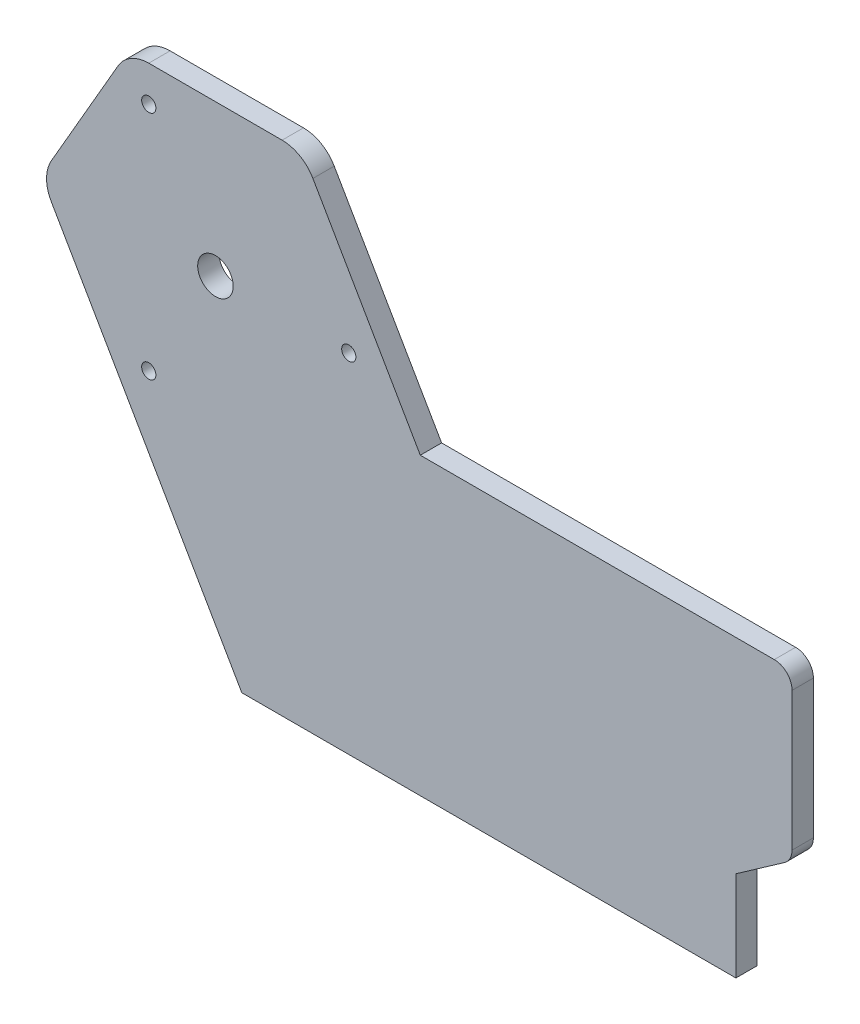
ISO-10303-21;
HEADER;
FILE_DESCRIPTION(('STEP AP214'),'2;1');
FILE_NAME('part.step','',(''),(''),'','','');
FILE_SCHEMA(('AUTOMOTIVE_DESIGN { 1 0 10303 214 1 1 1 1 }'));
ENDSEC;
DATA;
#1=APPLICATION_CONTEXT('core data for automotive mechanical design processes');
#2=APPLICATION_PROTOCOL_DEFINITION('international standard','automotive_design',2000,#1);
#3=PRODUCT_CONTEXT('',#1,'mechanical');
#4=PRODUCT('Part','Part','',(#3));
#5=PRODUCT_RELATED_PRODUCT_CATEGORY('part','',(#4));
#6=PRODUCT_DEFINITION_FORMATION('','',#4);
#7=PRODUCT_DEFINITION_CONTEXT('part definition',#1,'design');
#8=PRODUCT_DEFINITION('design','',#6,#7);
#9=PRODUCT_DEFINITION_SHAPE('','',#8);
#10=(LENGTH_UNIT() NAMED_UNIT(*) SI_UNIT(.MILLI.,.METRE.));
#11=(NAMED_UNIT(*) PLANE_ANGLE_UNIT() SI_UNIT($,.RADIAN.));
#12=(NAMED_UNIT(*) SI_UNIT($,.STERADIAN.) SOLID_ANGLE_UNIT());
#13=UNCERTAINTY_MEASURE_WITH_UNIT(LENGTH_MEASURE(1.E-05),#10,'distance_accuracy_value','');
#14=(GEOMETRIC_REPRESENTATION_CONTEXT(3) GLOBAL_UNCERTAINTY_ASSIGNED_CONTEXT((#13)) GLOBAL_UNIT_ASSIGNED_CONTEXT((#10,
#11,#12)) REPRESENTATION_CONTEXT('',''));
#15=CARTESIAN_POINT('',(0.,0.,0.));
#16=DIRECTION('',(0.,0.,1.));
#17=DIRECTION('',(1.,0.,0.));
#18=AXIS2_PLACEMENT_3D('',#15,#16,#17);
#19=CARTESIAN_POINT('',(-113.992395273856,119.84549882332,6.));
#20=DIRECTION('',(0.,0.,1.));
#21=DIRECTION('',(1.,0.,0.));
#22=AXIS2_PLACEMENT_3D('',#19,#20,#21);
#23=PLANE('',#22);
#24=CARTESIAN_POINT('',(-76.4646277765105,119.845498823282,6.));
#25=DIRECTION('',(0.,0.,1.));
#26=DIRECTION('',(1.,0.,0.));
#27=AXIS2_PLACEMENT_3D('',#24,#25,#26);
#28=CIRCLE('',#27,5.00000000000002);
#29=CARTESIAN_POINT('',(-71.4646277765105,119.845498823282,6.));
#30=VERTEX_POINT('',#29);
#31=EDGE_CURVE('E325',#30,#30,#28,.T.);
#32=ORIENTED_EDGE('',*,*,#31,.F.);
#33=EDGE_LOOP('',(#32));
#34=FACE_BOUND('',#33,.T.);
#35=CARTESIAN_POINT('',(-95.2285115251751,87.3454988232823,6.));
#36=DIRECTION('',(0.,0.,1.));
#37=DIRECTION('',(1.,0.,0.));
#38=AXIS2_PLACEMENT_3D('',#35,#36,#37);
#39=CIRCLE('',#38,2.00000000000228);
#40=CARTESIAN_POINT('',(-93.2285115251728,87.3454988232823,6.));
#41=VERTEX_POINT('',#40);
#42=EDGE_CURVE('E178',#41,#41,#39,.T.);
#43=ORIENTED_EDGE('',*,*,#42,.F.);
#44=EDGE_LOOP('',(#43));
#45=FACE_BOUND('',#44,.T.);
#46=CARTESIAN_POINT('',(-113.992395273856,119.84549882332,6.));
#47=DIRECTION('',(0.,0.,1.));
#48=DIRECTION('',(1.,0.,0.));
#49=AXIS2_PLACEMENT_3D('',#46,#47,#48);
#50=CIRCLE('',#49,9.99999999999801);
#51=CARTESIAN_POINT('',(-122.652649311701,124.845498823314,6.));
#52=VERTEX_POINT('',#51);
#53=CARTESIAN_POINT('',(-122.652649311699,114.845498823321,6.));
#54=VERTEX_POINT('',#53);
#55=EDGE_CURVE('E201',#52,#54,#50,.T.);
#56=ORIENTED_EDGE('',*,*,#55,.T.);
#57=DIRECTION('',(0.500000000000001,-0.866025403784438,0.));
#58=VECTOR('',#57,1.);
#59=CARTESIAN_POINT('',(-122.652649311699,114.845498823321,6.));
#60=LINE('',#59,#58);
#61=CARTESIAN_POINT('',(-69.0482755730163,22.0000000000121,6.));
#62=VERTEX_POINT('',#61);
#63=EDGE_CURVE('E119',#54,#62,#60,.T.);
#64=ORIENTED_EDGE('',*,*,#63,.T.);
#65=DIRECTION('',(1.,0.,0.));
#66=VECTOR('',#65,1.);
#67=CARTESIAN_POINT('',(-69.0482755730163,22.0000000000121,6.));
#68=LINE('',#67,#66);
#69=CARTESIAN_POINT('',(69.9999999999969,22.0000000000121,6.));
#70=VERTEX_POINT('',#69);
#71=EDGE_CURVE('E234',#62,#70,#68,.T.);
#72=ORIENTED_EDGE('',*,*,#71,.T.);
#73=DIRECTION('',(0.,1.,0.));
#74=VECTOR('',#73,1.);
#75=CARTESIAN_POINT('',(69.9999999999969,22.0000000000121,6.));
#76=LINE('',#75,#74);
#77=CARTESIAN_POINT('',(69.9999999999969,47.4000000000146,6.));
#78=VERTEX_POINT('',#77);
#79=EDGE_CURVE('E253',#70,#78,#76,.T.);
#80=ORIENTED_EDGE('',*,*,#79,.T.);
#81=DIRECTION('',(0.819152044288992,0.573576436351046,0.));
#82=VECTOR('',#81,1.);
#83=CARTESIAN_POINT('',(69.9999999999969,47.4000000000146,6.));
#84=LINE('',#83,#82);
#85=CARTESIAN_POINT('',(83.6678821817522,56.9703541350418,6.));
#86=VERTEX_POINT('',#85);
#87=EDGE_CURVE('E250',#78,#86,#84,.T.);
#88=ORIENTED_EDGE('',*,*,#87,.T.);
#89=CARTESIAN_POINT('',(80.7999999999969,61.0661143564868,6.));
#90=DIRECTION('',(0.,0.,1.));
#91=DIRECTION('',(1.,0.,0.));
#92=AXIS2_PLACEMENT_3D('',#89,#90,#91);
#93=CIRCLE('',#92,5.00000000000002);
#94=CARTESIAN_POINT('',(85.799999999997,61.0661143564868,6.));
#95=VERTEX_POINT('',#94);
#96=EDGE_CURVE('E252',#86,#95,#93,.T.);
#97=ORIENTED_EDGE('',*,*,#96,.T.);
#98=DIRECTION('',(0.,1.,0.));
#99=VECTOR('',#98,1.);
#100=CARTESIAN_POINT('',(85.799999999997,61.0661143564868,6.));
#101=LINE('',#100,#99);
#102=CARTESIAN_POINT('',(85.799999999997,100.000000000015,6.));
#103=VERTEX_POINT('',#102);
#104=EDGE_CURVE('E255',#95,#103,#101,.T.);
#105=ORIENTED_EDGE('',*,*,#104,.T.);
#106=CARTESIAN_POINT('',(80.7999999999969,100.000000000015,6.));
#107=DIRECTION('',(0.,0.,1.));
#108=DIRECTION('',(1.,0.,0.));
#109=AXIS2_PLACEMENT_3D('',#106,#107,#108);
#110=CIRCLE('',#109,5.0000000000001);
#111=CARTESIAN_POINT('',(80.7999999999971,105.000000000015,6.));
#112=VERTEX_POINT('',#111);
#113=EDGE_CURVE('E261',#103,#112,#110,.T.);
#114=ORIENTED_EDGE('',*,*,#113,.T.);
#115=DIRECTION('',(-1.,0.,0.));
#116=VECTOR('',#115,1.);
#117=CARTESIAN_POINT('',(80.7999999999971,105.000000000015,6.));
#118=LINE('',#117,#116);
#119=CARTESIAN_POINT('',(-18.8188021535196,105.000000000015,6.));
#120=VERTEX_POINT('',#119);
#121=EDGE_CURVE('E263',#112,#120,#118,.T.);
#122=ORIENTED_EDGE('',*,*,#121,.T.);
#123=DIRECTION('',(-0.500000000000001,0.866025403784438,0.));
#124=VECTOR('',#123,1.);
#125=CARTESIAN_POINT('',(-18.8188021535196,105.000000000015,6.));
#126=LINE('',#125,#124);
#127=CARTESIAN_POINT('',(-49.0404899900016,157.345498823288,6.));
#128=VERTEX_POINT('',#127);
#129=EDGE_CURVE('E265',#120,#128,#126,.T.);
#130=ORIENTED_EDGE('',*,*,#129,.T.);
#131=CARTESIAN_POINT('',(-57.7007440278447,152.345498823289,6.));
#132=DIRECTION('',(0.,0.,1.));
#133=DIRECTION('',(1.,0.,0.));
#134=AXIS2_PLACEMENT_3D('',#131,#132,#133);
#135=CIRCLE('',#134,9.99999999999843);
#136=CARTESIAN_POINT('',(-57.700744027845,162.345498823288,6.));
#137=VERTEX_POINT('',#136);
#138=EDGE_CURVE('E156',#128,#137,#135,.T.);
#139=ORIENTED_EDGE('',*,*,#138,.T.);
#140=DIRECTION('',(-1.,0.,0.));
#141=VECTOR('',#140,1.);
#142=CARTESIAN_POINT('',(-57.700744027845,162.345498823288,6.));
#143=LINE('',#142,#141);
#144=CARTESIAN_POINT('',(-95.2285115251706,162.345498823288,6.));
#145=VERTEX_POINT('',#144);
#146=EDGE_CURVE('E150',#137,#145,#143,.T.);
#147=ORIENTED_EDGE('',*,*,#146,.T.);
#148=CARTESIAN_POINT('',(-95.2285115251707,152.34549882329,6.));
#149=DIRECTION('',(0.,0.,1.));
#150=DIRECTION('',(1.,0.,0.));
#151=AXIS2_PLACEMENT_3D('',#148,#149,#150);
#152=CIRCLE('',#151,9.99999999999811);
#153=CARTESIAN_POINT('',(-103.888765563009,157.345498823297,6.));
#154=VERTEX_POINT('',#153);
#155=EDGE_CURVE('E154',#145,#154,#152,.T.);
#156=ORIENTED_EDGE('',*,*,#155,.T.);
#157=DIRECTION('',(-0.500000000000793,-0.866025403783981,0.));
#158=VECTOR('',#157,1.);
#159=CARTESIAN_POINT('',(-103.888765563009,157.345498823297,6.));
#160=LINE('',#159,#158);
#161=EDGE_CURVE('E58',#154,#52,#160,.T.);
#162=ORIENTED_EDGE('',*,*,#161,.T.);
#163=EDGE_LOOP('',(#56,#64,#72,#80,#88,#97,#105,#114,#122,#130,#139,#147,#156,#162));
#164=FACE_BOUND('',#163,.T.);
#165=CARTESIAN_POINT('',(-38.9368602791866,119.845498823281,6.));
#166=DIRECTION('',(0.,0.,1.));
#167=DIRECTION('',(1.,0.,0.));
#168=AXIS2_PLACEMENT_3D('',#165,#166,#167);
#169=CIRCLE('',#168,2.00000000000126);
#170=CARTESIAN_POINT('',(-36.9368602791853,119.845498823281,6.));
#171=VERTEX_POINT('',#170);
#172=EDGE_CURVE('E331',#171,#171,#169,.T.);
#173=ORIENTED_EDGE('',*,*,#172,.F.);
#174=EDGE_LOOP('',(#173));
#175=FACE_BOUND('',#174,.T.);
#176=CARTESIAN_POINT('',(-95.2285115251689,152.345498823293,6.));
#177=DIRECTION('',(0.,0.,1.));
#178=DIRECTION('',(1.,0.,0.));
#179=AXIS2_PLACEMENT_3D('',#176,#177,#178);
#180=CIRCLE('',#179,1.99999999999306);
#181=CARTESIAN_POINT('',(-93.2285115251759,152.345498823293,6.));
#182=VERTEX_POINT('',#181);
#183=EDGE_CURVE('E316',#182,#182,#180,.T.);
#184=ORIENTED_EDGE('',*,*,#183,.F.);
#185=EDGE_LOOP('',(#184));
#186=FACE_BOUND('',#185,.T.);
#187=ADVANCED_FACE('F41',(#34,#45,#164,#175,#186),#23,.T.);
#188=CARTESIAN_POINT('',(-113.992395273856,119.84549882332,0.));
#189=DIRECTION('',(0.,0.,1.));
#190=DIRECTION('',(1.,0.,0.));
#191=AXIS2_PLACEMENT_3D('',#188,#189,#190);
#192=PLANE('',#191);
#193=CARTESIAN_POINT('',(-113.992395273856,119.84549882332,0.));
#194=DIRECTION('',(0.,0.,1.));
#195=DIRECTION('',(1.,0.,0.));
#196=AXIS2_PLACEMENT_3D('',#193,#194,#195);
#197=CIRCLE('',#196,9.99999999999801);
#198=CARTESIAN_POINT('',(-122.652649311701,124.845498823314,0.));
#199=VERTEX_POINT('',#198);
#200=CARTESIAN_POINT('',(-122.652649311699,114.845498823321,0.));
#201=VERTEX_POINT('',#200);
#202=EDGE_CURVE('E174',#199,#201,#197,.T.);
#203=ORIENTED_EDGE('',*,*,#202,.F.);
#204=DIRECTION('',(-0.500000000000793,-0.866025403783981,0.));
#205=VECTOR('',#204,1.);
#206=CARTESIAN_POINT('',(-103.888765563009,157.345498823297,0.));
#207=LINE('',#206,#205);
#208=CARTESIAN_POINT('',(-103.888765563009,157.345498823297,0.));
#209=VERTEX_POINT('',#208);
#210=EDGE_CURVE('E111',#209,#199,#207,.T.);
#211=ORIENTED_EDGE('',*,*,#210,.F.);
#212=CARTESIAN_POINT('',(-95.2285115251707,152.34549882329,0.));
#213=DIRECTION('',(0.,0.,1.));
#214=DIRECTION('',(1.,0.,0.));
#215=AXIS2_PLACEMENT_3D('',#212,#213,#214);
#216=CIRCLE('',#215,9.99999999999811);
#217=CARTESIAN_POINT('',(-95.2285115251706,162.345498823288,0.));
#218=VERTEX_POINT('',#217);
#219=EDGE_CURVE('E105',#218,#209,#216,.T.);
#220=ORIENTED_EDGE('',*,*,#219,.F.);
#221=DIRECTION('',(-1.,0.,0.));
#222=VECTOR('',#221,1.);
#223=CARTESIAN_POINT('',(-57.700744027845,162.345498823288,0.));
#224=LINE('',#223,#222);
#225=CARTESIAN_POINT('',(-57.700744027845,162.345498823288,0.));
#226=VERTEX_POINT('',#225);
#227=EDGE_CURVE('E164',#226,#218,#224,.T.);
#228=ORIENTED_EDGE('',*,*,#227,.F.);
#229=CARTESIAN_POINT('',(-57.7007440278447,152.345498823289,0.));
#230=DIRECTION('',(0.,0.,1.));
#231=DIRECTION('',(1.,0.,0.));
#232=AXIS2_PLACEMENT_3D('',#229,#230,#231);
#233=CIRCLE('',#232,9.99999999999843);
#234=CARTESIAN_POINT('',(-49.0404899900016,157.345498823288,0.));
#235=VERTEX_POINT('',#234);
#236=EDGE_CURVE('E196',#235,#226,#233,.T.);
#237=ORIENTED_EDGE('',*,*,#236,.F.);
#238=DIRECTION('',(-0.500000000000001,0.866025403784438,0.));
#239=VECTOR('',#238,1.);
#240=CARTESIAN_POINT('',(-18.8188021535196,105.000000000015,0.));
#241=LINE('',#240,#239);
#242=CARTESIAN_POINT('',(-18.8188021535196,105.000000000015,0.));
#243=VERTEX_POINT('',#242);
#244=EDGE_CURVE('E194',#243,#235,#241,.T.);
#245=ORIENTED_EDGE('',*,*,#244,.F.);
#246=DIRECTION('',(-1.,0.,0.));
#247=VECTOR('',#246,1.);
#248=CARTESIAN_POINT('',(80.7999999999971,105.000000000015,0.));
#249=LINE('',#248,#247);
#250=CARTESIAN_POINT('',(80.7999999999971,105.000000000015,0.));
#251=VERTEX_POINT('',#250);
#252=EDGE_CURVE('E192',#251,#243,#249,.T.);
#253=ORIENTED_EDGE('',*,*,#252,.F.);
#254=CARTESIAN_POINT('',(80.7999999999969,100.000000000015,0.));
#255=DIRECTION('',(0.,0.,1.));
#256=DIRECTION('',(1.,0.,0.));
#257=AXIS2_PLACEMENT_3D('',#254,#255,#256);
#258=CIRCLE('',#257,5.0000000000001);
#259=CARTESIAN_POINT('',(85.799999999997,100.000000000015,0.));
#260=VERTEX_POINT('',#259);
#261=EDGE_CURVE('E190',#260,#251,#258,.T.);
#262=ORIENTED_EDGE('',*,*,#261,.F.);
#263=DIRECTION('',(0.,1.,0.));
#264=VECTOR('',#263,1.);
#265=CARTESIAN_POINT('',(85.799999999997,61.0661143564868,0.));
#266=LINE('',#265,#264);
#267=CARTESIAN_POINT('',(85.799999999997,61.0661143564868,0.));
#268=VERTEX_POINT('',#267);
#269=EDGE_CURVE('E188',#268,#260,#266,.T.);
#270=ORIENTED_EDGE('',*,*,#269,.F.);
#271=CARTESIAN_POINT('',(80.7999999999969,61.0661143564868,0.));
#272=DIRECTION('',(0.,0.,1.));
#273=DIRECTION('',(1.,0.,0.));
#274=AXIS2_PLACEMENT_3D('',#271,#272,#273);
#275=CIRCLE('',#274,5.00000000000002);
#276=CARTESIAN_POINT('',(83.6678821817522,56.9703541350418,0.));
#277=VERTEX_POINT('',#276);
#278=EDGE_CURVE('E186',#277,#268,#275,.T.);
#279=ORIENTED_EDGE('',*,*,#278,.F.);
#280=DIRECTION('',(0.819152044288992,0.573576436351046,0.));
#281=VECTOR('',#280,1.);
#282=CARTESIAN_POINT('',(69.9999999999969,47.4000000000146,0.));
#283=LINE('',#282,#281);
#284=CARTESIAN_POINT('',(69.9999999999969,47.4000000000146,0.));
#285=VERTEX_POINT('',#284);
#286=EDGE_CURVE('E184',#285,#277,#283,.T.);
#287=ORIENTED_EDGE('',*,*,#286,.F.);
#288=DIRECTION('',(0.,1.,0.));
#289=VECTOR('',#288,1.);
#290=CARTESIAN_POINT('',(69.9999999999969,22.0000000000121,0.));
#291=LINE('',#290,#289);
#292=CARTESIAN_POINT('',(69.9999999999969,22.0000000000121,0.));
#293=VERTEX_POINT('',#292);
#294=EDGE_CURVE('E182',#293,#285,#291,.T.);
#295=ORIENTED_EDGE('',*,*,#294,.F.);
#296=DIRECTION('',(1.,0.,0.));
#297=VECTOR('',#296,1.);
#298=CARTESIAN_POINT('',(-69.0482755730163,22.0000000000121,0.));
#299=LINE('',#298,#297);
#300=CARTESIAN_POINT('',(-69.0482755730163,22.0000000000121,0.));
#301=VERTEX_POINT('',#300);
#302=EDGE_CURVE('E180',#301,#293,#299,.T.);
#303=ORIENTED_EDGE('',*,*,#302,.F.);
#304=DIRECTION('',(0.500000000000001,-0.866025403784438,0.));
#305=VECTOR('',#304,1.);
#306=CARTESIAN_POINT('',(-122.652649311699,114.845498823321,0.));
#307=LINE('',#306,#305);
#308=EDGE_CURVE('E177',#201,#301,#307,.T.);
#309=ORIENTED_EDGE('',*,*,#308,.F.);
#310=EDGE_LOOP('',(#203,#211,#220,#228,#237,#245,#253,#262,#270,#279,#287,#295,#303,#309));
#311=FACE_BOUND('',#310,.T.);
#312=CARTESIAN_POINT('',(-95.2285115251751,87.3454988232823,0.));
#313=DIRECTION('',(0.,0.,1.));
#314=DIRECTION('',(1.,0.,0.));
#315=AXIS2_PLACEMENT_3D('',#312,#313,#314);
#316=CIRCLE('',#315,2.00000000000228);
#317=CARTESIAN_POINT('',(-93.2285115251728,87.3454988232823,0.));
#318=VERTEX_POINT('',#317);
#319=EDGE_CURVE('E334',#318,#318,#316,.T.);
#320=ORIENTED_EDGE('',*,*,#319,.T.);
#321=EDGE_LOOP('',(#320));
#322=FACE_BOUND('',#321,.T.);
#323=CARTESIAN_POINT('',(-38.9368602791866,119.845498823281,0.));
#324=DIRECTION('',(0.,0.,1.));
#325=DIRECTION('',(1.,0.,0.));
#326=AXIS2_PLACEMENT_3D('',#323,#324,#325);
#327=CIRCLE('',#326,2.00000000000126);
#328=CARTESIAN_POINT('',(-36.9368602791853,119.845498823281,0.));
#329=VERTEX_POINT('',#328);
#330=EDGE_CURVE('E328',#329,#329,#327,.T.);
#331=ORIENTED_EDGE('',*,*,#330,.T.);
#332=EDGE_LOOP('',(#331));
#333=FACE_BOUND('',#332,.T.);
#334=CARTESIAN_POINT('',(-76.4646277765105,119.845498823282,0.));
#335=DIRECTION('',(0.,0.,1.));
#336=DIRECTION('',(1.,0.,0.));
#337=AXIS2_PLACEMENT_3D('',#334,#335,#336);
#338=CIRCLE('',#337,5.00000000000002);
#339=CARTESIAN_POINT('',(-71.4646277765105,119.845498823282,0.));
#340=VERTEX_POINT('',#339);
#341=EDGE_CURVE('E322',#340,#340,#338,.T.);
#342=ORIENTED_EDGE('',*,*,#341,.T.);
#343=EDGE_LOOP('',(#342));
#344=FACE_BOUND('',#343,.T.);
#345=CARTESIAN_POINT('',(-95.2285115251689,152.345498823293,0.));
#346=DIRECTION('',(0.,0.,1.));
#347=DIRECTION('',(1.,0.,0.));
#348=AXIS2_PLACEMENT_3D('',#345,#346,#347);
#349=CIRCLE('',#348,1.99999999999306);
#350=CARTESIAN_POINT('',(-93.2285115251759,152.345498823293,0.));
#351=VERTEX_POINT('',#350);
#352=EDGE_CURVE('E319',#351,#351,#349,.T.);
#353=ORIENTED_EDGE('',*,*,#352,.T.);
#354=EDGE_LOOP('',(#353));
#355=FACE_BOUND('',#354,.T.);
#356=ADVANCED_FACE('F238',(#311,#322,#333,#344,#355),#192,.F.);
#357=CARTESIAN_POINT('',(-113.992395273856,119.84549882332,6.));
#358=DIRECTION('',(0.,0.,-1.));
#359=DIRECTION('',(-1.,0.,0.));
#360=AXIS2_PLACEMENT_3D('',#357,#358,#359);
#361=CYLINDRICAL_SURFACE('',#360,9.99999999999801);
#362=ORIENTED_EDGE('',*,*,#202,.T.);
#363=DIRECTION('',(0.,0.,-1.));
#364=VECTOR('',#363,1.);
#365=CARTESIAN_POINT('',(-122.652649311699,114.845498823321,6.));
#366=LINE('',#365,#364);
#367=EDGE_CURVE('E11',#54,#201,#366,.T.);
#368=ORIENTED_EDGE('',*,*,#367,.F.);
#369=ORIENTED_EDGE('',*,*,#55,.F.);
#370=DIRECTION('',(0.,0.,-1.));
#371=VECTOR('',#370,1.);
#372=CARTESIAN_POINT('',(-122.652649311701,124.845498823314,6.));
#373=LINE('',#372,#371);
#374=EDGE_CURVE('E170',#52,#199,#373,.T.);
#375=ORIENTED_EDGE('',*,*,#374,.T.);
#376=EDGE_LOOP('',(#362,#368,#369,#375));
#377=FACE_BOUND('',#376,.T.);
#378=ADVANCED_FACE('F43',(#377),#361,.T.);
#379=CARTESIAN_POINT('',(-122.652649311699,114.845498823321,6.));
#380=DIRECTION('',(0.866025403784438,0.500000000000001,0.));
#381=DIRECTION('',(-0.500000000000001,0.866025403784438,0.));
#382=AXIS2_PLACEMENT_3D('',#379,#380,#381);
#383=PLANE('',#382);
#384=ORIENTED_EDGE('',*,*,#308,.T.);
#385=DIRECTION('',(0.,0.,-1.));
#386=VECTOR('',#385,1.);
#387=CARTESIAN_POINT('',(-69.0482755730163,22.0000000000121,6.));
#388=LINE('',#387,#386);
#389=EDGE_CURVE('E50',#62,#301,#388,.T.);
#390=ORIENTED_EDGE('',*,*,#389,.F.);
#391=ORIENTED_EDGE('',*,*,#63,.F.);
#392=ORIENTED_EDGE('',*,*,#367,.T.);
#393=EDGE_LOOP('',(#384,#390,#391,#392));
#394=FACE_BOUND('',#393,.T.);
#395=ADVANCED_FACE('F476',(#394),#383,.F.);
#396=CARTESIAN_POINT('',(-69.0482755730163,22.0000000000121,6.));
#397=DIRECTION('',(0.,1.,0.));
#398=DIRECTION('',(0.,0.,1.));
#399=AXIS2_PLACEMENT_3D('',#396,#397,#398);
#400=PLANE('',#399);
#401=ORIENTED_EDGE('',*,*,#302,.T.);
#402=DIRECTION('',(0.,0.,-1.));
#403=VECTOR('',#402,1.);
#404=CARTESIAN_POINT('',(69.9999999999969,22.0000000000121,6.));
#405=LINE('',#404,#403);
#406=EDGE_CURVE('E226',#70,#293,#405,.T.);
#407=ORIENTED_EDGE('',*,*,#406,.F.);
#408=ORIENTED_EDGE('',*,*,#71,.F.);
#409=ORIENTED_EDGE('',*,*,#389,.T.);
#410=EDGE_LOOP('',(#401,#407,#408,#409));
#411=FACE_BOUND('',#410,.T.);
#412=ADVANCED_FACE('F232',(#411),#400,.F.);
#413=CARTESIAN_POINT('',(69.9999999999969,22.0000000000121,6.));
#414=DIRECTION('',(-1.,0.,0.));
#415=DIRECTION('',(0.,-1.,0.));
#416=AXIS2_PLACEMENT_3D('',#413,#414,#415);
#417=PLANE('',#416);
#418=ORIENTED_EDGE('',*,*,#294,.T.);
#419=DIRECTION('',(0.,0.,-1.));
#420=VECTOR('',#419,1.);
#421=CARTESIAN_POINT('',(69.9999999999969,47.4000000000146,6.));
#422=LINE('',#421,#420);
#423=EDGE_CURVE('E223',#78,#285,#422,.T.);
#424=ORIENTED_EDGE('',*,*,#423,.F.);
#425=ORIENTED_EDGE('',*,*,#79,.F.);
#426=ORIENTED_EDGE('',*,*,#406,.T.);
#427=EDGE_LOOP('',(#418,#424,#425,#426));
#428=FACE_BOUND('',#427,.T.);
#429=ADVANCED_FACE('F244',(#428),#417,.F.);
#430=CARTESIAN_POINT('',(69.9999999999969,47.4000000000146,6.));
#431=DIRECTION('',(-0.573576436351046,0.819152044288991,0.));
#432=DIRECTION('',(-0.819152044288992,-0.573576436351046,0.));
#433=AXIS2_PLACEMENT_3D('',#430,#431,#432);
#434=PLANE('',#433);
#435=ORIENTED_EDGE('',*,*,#286,.T.);
#436=DIRECTION('',(0.,0.,-1.));
#437=VECTOR('',#436,1.);
#438=CARTESIAN_POINT('',(83.6678821817522,56.9703541350418,6.));
#439=LINE('',#438,#437);
#440=EDGE_CURVE('E220',#86,#277,#439,.T.);
#441=ORIENTED_EDGE('',*,*,#440,.F.);
#442=ORIENTED_EDGE('',*,*,#87,.F.);
#443=ORIENTED_EDGE('',*,*,#423,.T.);
#444=EDGE_LOOP('',(#435,#441,#442,#443));
#445=FACE_BOUND('',#444,.T.);
#446=ADVANCED_FACE('F248',(#445),#434,.F.);
#447=CARTESIAN_POINT('',(80.7999999999969,61.0661143564868,6.));
#448=DIRECTION('',(0.,0.,-1.));
#449=DIRECTION('',(-1.,0.,0.));
#450=AXIS2_PLACEMENT_3D('',#447,#448,#449);
#451=CYLINDRICAL_SURFACE('',#450,5.00000000000002);
#452=ORIENTED_EDGE('',*,*,#278,.T.);
#453=DIRECTION('',(0.,0.,-1.));
#454=VECTOR('',#453,1.);
#455=CARTESIAN_POINT('',(85.799999999997,61.0661143564868,6.));
#456=LINE('',#455,#454);
#457=EDGE_CURVE('E217',#95,#268,#456,.T.);
#458=ORIENTED_EDGE('',*,*,#457,.F.);
#459=ORIENTED_EDGE('',*,*,#96,.F.);
#460=ORIENTED_EDGE('',*,*,#440,.T.);
#461=EDGE_LOOP('',(#452,#458,#459,#460));
#462=FACE_BOUND('',#461,.T.);
#463=ADVANCED_FACE('F437',(#462),#451,.T.);
#464=CARTESIAN_POINT('',(85.799999999997,61.0661143564868,6.));
#465=DIRECTION('',(-1.,0.,0.));
#466=DIRECTION('',(0.,0.,1.));
#467=AXIS2_PLACEMENT_3D('',#464,#465,#466);
#468=PLANE('',#467);
#469=ORIENTED_EDGE('',*,*,#269,.T.);
#470=DIRECTION('',(0.,0.,-1.));
#471=VECTOR('',#470,1.);
#472=CARTESIAN_POINT('',(85.799999999997,100.000000000015,6.));
#473=LINE('',#472,#471);
#474=EDGE_CURVE('E214',#103,#260,#473,.T.);
#475=ORIENTED_EDGE('',*,*,#474,.F.);
#476=ORIENTED_EDGE('',*,*,#104,.F.);
#477=ORIENTED_EDGE('',*,*,#457,.T.);
#478=EDGE_LOOP('',(#469,#475,#476,#477));
#479=FACE_BOUND('',#478,.T.);
#480=ADVANCED_FACE('F426',(#479),#468,.F.);
#481=CARTESIAN_POINT('',(80.7999999999969,100.000000000015,6.));
#482=DIRECTION('',(0.,0.,-1.));
#483=DIRECTION('',(-1.,0.,0.));
#484=AXIS2_PLACEMENT_3D('',#481,#482,#483);
#485=CYLINDRICAL_SURFACE('',#484,5.0000000000001);
#486=ORIENTED_EDGE('',*,*,#261,.T.);
#487=DIRECTION('',(0.,0.,-1.));
#488=VECTOR('',#487,1.);
#489=CARTESIAN_POINT('',(80.7999999999971,105.000000000015,6.));
#490=LINE('',#489,#488);
#491=EDGE_CURVE('E211',#112,#251,#490,.T.);
#492=ORIENTED_EDGE('',*,*,#491,.F.);
#493=ORIENTED_EDGE('',*,*,#113,.F.);
#494=ORIENTED_EDGE('',*,*,#474,.T.);
#495=EDGE_LOOP('',(#486,#492,#493,#494));
#496=FACE_BOUND('',#495,.T.);
#497=ADVANCED_FACE('F415',(#496),#485,.T.);
#498=CARTESIAN_POINT('',(80.7999999999971,105.000000000015,6.));
#499=DIRECTION('',(0.,-1.,0.));
#500=DIRECTION('',(1.,0.,0.));
#501=AXIS2_PLACEMENT_3D('',#498,#499,#500);
#502=PLANE('',#501);
#503=ORIENTED_EDGE('',*,*,#252,.T.);
#504=DIRECTION('',(0.,0.,-1.));
#505=VECTOR('',#504,1.);
#506=CARTESIAN_POINT('',(-18.8188021535196,105.000000000015,6.));
#507=LINE('',#506,#505);
#508=EDGE_CURVE('E208',#120,#243,#507,.T.);
#509=ORIENTED_EDGE('',*,*,#508,.F.);
#510=ORIENTED_EDGE('',*,*,#121,.F.);
#511=ORIENTED_EDGE('',*,*,#491,.T.);
#512=EDGE_LOOP('',(#503,#509,#510,#511));
#513=FACE_BOUND('',#512,.T.);
#514=ADVANCED_FACE('F405',(#513),#502,.F.);
#515=CARTESIAN_POINT('',(-18.8188021535196,105.000000000015,6.));
#516=DIRECTION('',(-0.866025403784438,-0.500000000000001,0.));
#517=DIRECTION('',(0.500000000000001,-0.866025403784438,0.));
#518=AXIS2_PLACEMENT_3D('',#515,#516,#517);
#519=PLANE('',#518);
#520=ORIENTED_EDGE('',*,*,#244,.T.);
#521=DIRECTION('',(0.,0.,-1.));
#522=VECTOR('',#521,1.);
#523=CARTESIAN_POINT('',(-49.0404899900016,157.345498823288,6.));
#524=LINE('',#523,#522);
#525=EDGE_CURVE('E205',#128,#235,#524,.T.);
#526=ORIENTED_EDGE('',*,*,#525,.F.);
#527=ORIENTED_EDGE('',*,*,#129,.F.);
#528=ORIENTED_EDGE('',*,*,#508,.T.);
#529=EDGE_LOOP('',(#520,#526,#527,#528));
#530=FACE_BOUND('',#529,.T.);
#531=ADVANCED_FACE('F271',(#530),#519,.F.);
#532=CARTESIAN_POINT('',(-57.7007440278447,152.345498823289,6.));
#533=DIRECTION('',(0.,0.,-1.));
#534=DIRECTION('',(-1.,0.,0.));
#535=AXIS2_PLACEMENT_3D('',#532,#533,#534);
#536=CYLINDRICAL_SURFACE('',#535,9.99999999999843);
#537=ORIENTED_EDGE('',*,*,#236,.T.);
#538=DIRECTION('',(0.,0.,-1.));
#539=VECTOR('',#538,1.);
#540=CARTESIAN_POINT('',(-57.700744027845,162.345498823288,6.));
#541=LINE('',#540,#539);
#542=EDGE_CURVE('E165',#137,#226,#541,.T.);
#543=ORIENTED_EDGE('',*,*,#542,.F.);
#544=ORIENTED_EDGE('',*,*,#138,.F.);
#545=ORIENTED_EDGE('',*,*,#525,.T.);
#546=EDGE_LOOP('',(#537,#543,#544,#545));
#547=FACE_BOUND('',#546,.T.);
#548=ADVANCED_FACE('F275',(#547),#536,.T.);
#549=CARTESIAN_POINT('',(-57.700744027845,162.345498823288,6.));
#550=DIRECTION('',(0.,-1.,0.));
#551=DIRECTION('',(1.,0.,0.));
#552=AXIS2_PLACEMENT_3D('',#549,#550,#551);
#553=PLANE('',#552);
#554=ORIENTED_EDGE('',*,*,#227,.T.);
#555=DIRECTION('',(0.,0.,-1.));
#556=VECTOR('',#555,1.);
#557=CARTESIAN_POINT('',(-95.2285115251706,162.345498823288,6.));
#558=LINE('',#557,#556);
#559=EDGE_CURVE('E161',#145,#218,#558,.T.);
#560=ORIENTED_EDGE('',*,*,#559,.F.);
#561=ORIENTED_EDGE('',*,*,#146,.F.);
#562=ORIENTED_EDGE('',*,*,#542,.T.);
#563=EDGE_LOOP('',(#554,#560,#561,#562));
#564=FACE_BOUND('',#563,.T.);
#565=ADVANCED_FACE('F162',(#564),#553,.F.);
#566=CARTESIAN_POINT('',(-95.2285115251707,152.34549882329,6.));
#567=DIRECTION('',(0.,0.,-1.));
#568=DIRECTION('',(-1.,0.,0.));
#569=AXIS2_PLACEMENT_3D('',#566,#567,#568);
#570=CYLINDRICAL_SURFACE('',#569,9.99999999999811);
#571=ORIENTED_EDGE('',*,*,#219,.T.);
#572=DIRECTION('',(0.,0.,-1.));
#573=VECTOR('',#572,1.);
#574=CARTESIAN_POINT('',(-103.888765563009,157.345498823297,6.));
#575=LINE('',#574,#573);
#576=EDGE_CURVE('E166',#154,#209,#575,.T.);
#577=ORIENTED_EDGE('',*,*,#576,.F.);
#578=ORIENTED_EDGE('',*,*,#155,.F.);
#579=ORIENTED_EDGE('',*,*,#559,.T.);
#580=EDGE_LOOP('',(#571,#577,#578,#579));
#581=FACE_BOUND('',#580,.T.);
#582=ADVANCED_FACE('F168',(#581),#570,.T.);
#583=CARTESIAN_POINT('',(-103.888765563009,157.345498823297,6.));
#584=DIRECTION('',(0.866025403783981,-0.500000000000793,0.));
#585=DIRECTION('',(0.500000000000793,0.866025403783981,0.));
#586=AXIS2_PLACEMENT_3D('',#583,#584,#585);
#587=PLANE('',#586);
#588=ORIENTED_EDGE('',*,*,#210,.T.);
#589=ORIENTED_EDGE('',*,*,#374,.F.);
#590=ORIENTED_EDGE('',*,*,#161,.F.);
#591=ORIENTED_EDGE('',*,*,#576,.T.);
#592=EDGE_LOOP('',(#588,#589,#590,#591));
#593=FACE_BOUND('',#592,.T.);
#594=ADVANCED_FACE('F279',(#593),#587,.F.);
#595=CARTESIAN_POINT('',(-95.2285115251751,87.3454988232823,6.));
#596=DIRECTION('',(0.,0.,-1.));
#597=DIRECTION('',(-1.,0.,0.));
#598=AXIS2_PLACEMENT_3D('',#595,#596,#597);
#599=CYLINDRICAL_SURFACE('',#598,2.00000000000228);
#600=ORIENTED_EDGE('',*,*,#42,.T.);
#601=EDGE_LOOP('',(#600));
#602=FACE_BOUND('',#601,.T.);
#603=ORIENTED_EDGE('',*,*,#319,.F.);
#604=EDGE_LOOP('',(#603));
#605=FACE_BOUND('',#604,.T.);
#606=ADVANCED_FACE('F281',(#602,#605),#599,.F.);
#607=CARTESIAN_POINT('',(-38.9368602791866,119.845498823281,6.));
#608=DIRECTION('',(0.,0.,-1.));
#609=DIRECTION('',(-1.,0.,0.));
#610=AXIS2_PLACEMENT_3D('',#607,#608,#609);
#611=CYLINDRICAL_SURFACE('',#610,2.00000000000126);
#612=ORIENTED_EDGE('',*,*,#172,.T.);
#613=EDGE_LOOP('',(#612));
#614=FACE_BOUND('',#613,.T.);
#615=ORIENTED_EDGE('',*,*,#330,.F.);
#616=EDGE_LOOP('',(#615));
#617=FACE_BOUND('',#616,.T.);
#618=ADVANCED_FACE('F287',(#614,#617),#611,.F.);
#619=CARTESIAN_POINT('',(-76.4646277765105,119.845498823282,6.));
#620=DIRECTION('',(0.,0.,-1.));
#621=DIRECTION('',(-1.,0.,0.));
#622=AXIS2_PLACEMENT_3D('',#619,#620,#621);
#623=CYLINDRICAL_SURFACE('',#622,5.00000000000002);
#624=ORIENTED_EDGE('',*,*,#31,.T.);
#625=EDGE_LOOP('',(#624));
#626=FACE_BOUND('',#625,.T.);
#627=ORIENTED_EDGE('',*,*,#341,.F.);
#628=EDGE_LOOP('',(#627));
#629=FACE_BOUND('',#628,.T.);
#630=ADVANCED_FACE('F303',(#626,#629),#623,.F.);
#631=CARTESIAN_POINT('',(-95.2285115251689,152.345498823293,6.));
#632=DIRECTION('',(0.,0.,-1.));
#633=DIRECTION('',(-1.,0.,0.));
#634=AXIS2_PLACEMENT_3D('',#631,#632,#633);
#635=CYLINDRICAL_SURFACE('',#634,1.99999999999306);
#636=ORIENTED_EDGE('',*,*,#183,.T.);
#637=EDGE_LOOP('',(#636));
#638=FACE_BOUND('',#637,.T.);
#639=ORIENTED_EDGE('',*,*,#352,.F.);
#640=EDGE_LOOP('',(#639));
#641=FACE_BOUND('',#640,.T.);
#642=ADVANCED_FACE('F307',(#638,#641),#635,.F.);
#643=CLOSED_SHELL('',(#187,#356,#378,#395,#412,#429,#446,#463,#480,#497,#514,#531,#548,#565,
#582,#594,#606,#618,#630,#642));
#644=MANIFOLD_SOLID_BREP('B2',#643);
#645=ADVANCED_BREP_SHAPE_REPRESENTATION('',(#18,#644),#14);
#646=SHAPE_DEFINITION_REPRESENTATION(#9,#645);
ENDSEC;
END-ISO-10303-21;
